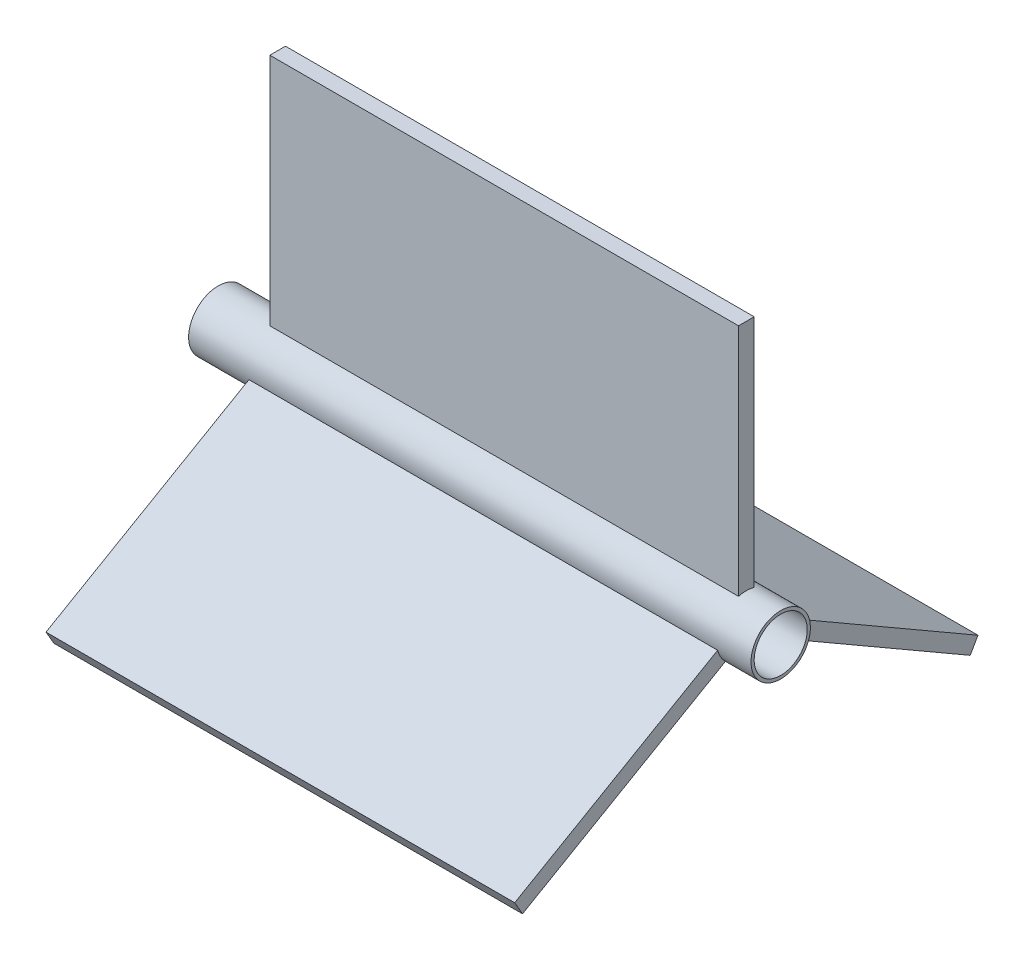
ISO-10303-21;
HEADER;
FILE_DESCRIPTION(('STEP AP214'),'2;1');
FILE_NAME('part.step','',(''),(''),'','','');
FILE_SCHEMA(('AUTOMOTIVE_DESIGN { 1 0 10303 214 1 1 1 1 }'));
ENDSEC;
DATA;
#1=APPLICATION_CONTEXT('core data for automotive mechanical design processes');
#2=APPLICATION_PROTOCOL_DEFINITION('international standard','automotive_design',2000,#1);
#3=PRODUCT_CONTEXT('',#1,'mechanical');
#4=PRODUCT('Part','Part','',(#3));
#5=PRODUCT_RELATED_PRODUCT_CATEGORY('part','',(#4));
#6=PRODUCT_DEFINITION_FORMATION('','',#4);
#7=PRODUCT_DEFINITION_CONTEXT('part definition',#1,'design');
#8=PRODUCT_DEFINITION('design','',#6,#7);
#9=PRODUCT_DEFINITION_SHAPE('','',#8);
#10=(LENGTH_UNIT() NAMED_UNIT(*) SI_UNIT(.MILLI.,.METRE.));
#11=(NAMED_UNIT(*) PLANE_ANGLE_UNIT() SI_UNIT($,.RADIAN.));
#12=(NAMED_UNIT(*) SI_UNIT($,.STERADIAN.) SOLID_ANGLE_UNIT());
#13=UNCERTAINTY_MEASURE_WITH_UNIT(LENGTH_MEASURE(1.E-05),#10,'distance_accuracy_value','');
#14=(GEOMETRIC_REPRESENTATION_CONTEXT(3) GLOBAL_UNCERTAINTY_ASSIGNED_CONTEXT((#13)) GLOBAL_UNIT_ASSIGNED_CONTEXT((#10,
#11,#12)) REPRESENTATION_CONTEXT('',''));
#15=CARTESIAN_POINT('',(0.,0.,0.));
#16=DIRECTION('',(0.,0.,1.));
#17=DIRECTION('',(1.,0.,0.));
#18=AXIS2_PLACEMENT_3D('',#15,#16,#17);
#19=CARTESIAN_POINT('',(180.,0.,0.));
#20=DIRECTION('',(-1.,0.,0.));
#21=DIRECTION('',(0.,0.,1.));
#22=AXIS2_PLACEMENT_3D('',#19,#20,#21);
#23=CYLINDRICAL_SURFACE('',#22,9.5);
#24=CARTESIAN_POINT('',(19.,0.,0.));
#25=DIRECTION('',(1.,0.,0.));
#26=DIRECTION('',(0.,0.,-1.));
#27=AXIS2_PLACEMENT_3D('',#24,#25,#26);
#28=CIRCLE('',#27,9.5);
#29=CARTESIAN_POINT('',(19.,-2.4175121854455,9.18725393302111));
#30=VERTEX_POINT('',#29);
#31=CARTESIAN_POINT('',(19.,-6.74763920444121,6.68725393315839));
#32=VERTEX_POINT('',#31);
#33=EDGE_CURVE('E231',#30,#32,#28,.T.);
#34=ORIENTED_EDGE('',*,*,#33,.F.);
#35=DIRECTION('',(1.,0.,0.));
#36=VECTOR('',#35,1.);
#37=CARTESIAN_POINT('',(19.,-2.4175121854455,9.18725393302111));
#38=LINE('',#37,#36);
#39=CARTESIAN_POINT('',(169.,-2.4175121854455,9.18725393302111));
#40=VERTEX_POINT('',#39);
#41=EDGE_CURVE('E170',#30,#40,#38,.T.);
#42=ORIENTED_EDGE('',*,*,#41,.T.);
#43=CARTESIAN_POINT('',(169.,0.,0.));
#44=DIRECTION('',(1.,0.,0.));
#45=DIRECTION('',(0.,0.,-1.));
#46=AXIS2_PLACEMENT_3D('',#43,#44,#45);
#47=CIRCLE('',#46,9.5);
#48=CARTESIAN_POINT('',(169.,-6.74763920443601,6.68725393317453));
#49=VERTEX_POINT('',#48);
#50=EDGE_CURVE('E228',#40,#49,#47,.T.);
#51=ORIENTED_EDGE('',*,*,#50,.T.);
#52=DIRECTION('',(1.,0.,0.));
#53=VECTOR('',#52,1.);
#54=CARTESIAN_POINT('',(19.,-6.74763920444121,6.68725393315839));
#55=LINE('',#54,#53);
#56=EDGE_CURVE('E167',#32,#49,#55,.T.);
#57=ORIENTED_EDGE('',*,*,#56,.F.);
#58=EDGE_LOOP('',(#34,#42,#51,#57));
#59=FACE_BOUND('',#58,.T.);
#60=CARTESIAN_POINT('',(0.,0.,0.));
#61=DIRECTION('',(1.,0.,0.));
#62=DIRECTION('',(0.,0.,-1.));
#63=AXIS2_PLACEMENT_3D('',#60,#61,#62);
#64=CIRCLE('',#63,9.5);
#65=CARTESIAN_POINT('',(0.,0.,-9.5));
#66=VERTEX_POINT('',#65);
#67=EDGE_CURVE('E210',#66,#66,#64,.T.);
#68=ORIENTED_EDGE('',*,*,#67,.T.);
#69=EDGE_LOOP('',(#68));
#70=FACE_BOUND('',#69,.T.);
#71=CARTESIAN_POINT('',(180.,0.,0.));
#72=DIRECTION('',(1.,0.,0.));
#73=DIRECTION('',(0.,0.,-1.));
#74=AXIS2_PLACEMENT_3D('',#71,#72,#73);
#75=CIRCLE('',#74,9.5);
#76=CARTESIAN_POINT('',(180.,0.,-9.5));
#77=VERTEX_POINT('',#76);
#78=EDGE_CURVE('E218',#77,#77,#75,.T.);
#79=ORIENTED_EDGE('',*,*,#78,.F.);
#80=EDGE_LOOP('',(#79));
#81=FACE_BOUND('',#80,.T.);
#82=CARTESIAN_POINT('',(19.,0.,0.));
#83=DIRECTION('',(1.,0.,0.));
#84=DIRECTION('',(0.,0.,-1.));
#85=AXIS2_PLACEMENT_3D('',#82,#83,#84);
#86=CIRCLE('',#85,9.5);
#87=CARTESIAN_POINT('',(19.,9.16515138993645,-2.49999999999773));
#88=VERTEX_POINT('',#87);
#89=CARTESIAN_POINT('',(19.,9.16515138993645,2.49999999999773));
#90=VERTEX_POINT('',#89);
#91=EDGE_CURVE('E226',#88,#90,#86,.T.);
#92=ORIENTED_EDGE('',*,*,#91,.F.);
#93=DIRECTION('',(1.,0.,0.));
#94=VECTOR('',#93,1.);
#95=CARTESIAN_POINT('',(19.,9.16515138993645,-2.49999999999773));
#96=LINE('',#95,#94);
#97=CARTESIAN_POINT('',(169.,9.16515138993645,-2.49999999999773));
#98=VERTEX_POINT('',#97);
#99=EDGE_CURVE('E213',#88,#98,#96,.T.);
#100=ORIENTED_EDGE('',*,*,#99,.T.);
#101=CARTESIAN_POINT('',(169.,0.,0.));
#102=DIRECTION('',(1.,0.,0.));
#103=DIRECTION('',(0.,0.,-1.));
#104=AXIS2_PLACEMENT_3D('',#101,#102,#103);
#105=CIRCLE('',#104,9.5);
#106=CARTESIAN_POINT('',(169.,9.16515138993645,2.49999999990917));
#107=VERTEX_POINT('',#106);
#108=EDGE_CURVE('E221',#98,#107,#105,.T.);
#109=ORIENTED_EDGE('',*,*,#108,.T.);
#110=DIRECTION('',(1.,0.,0.));
#111=VECTOR('',#110,1.);
#112=CARTESIAN_POINT('',(19.,9.16515138993645,2.49999999999773));
#113=LINE('',#112,#111);
#114=EDGE_CURVE('E201',#90,#107,#113,.T.);
#115=ORIENTED_EDGE('',*,*,#114,.F.);
#116=EDGE_LOOP('',(#92,#100,#109,#115));
#117=FACE_BOUND('',#116,.T.);
#118=CARTESIAN_POINT('',(19.,0.,0.));
#119=DIRECTION('',(1.,0.,0.));
#120=DIRECTION('',(0.,0.,-1.));
#121=AXIS2_PLACEMENT_3D('',#118,#119,#120);
#122=CIRCLE('',#121,9.5);
#123=CARTESIAN_POINT('',(19.,-6.74763920443411,-6.68725393322234));
#124=VERTEX_POINT('',#123);
#125=CARTESIAN_POINT('',(19.,-2.41751218533182,-9.18725393327691));
#126=VERTEX_POINT('',#125);
#127=EDGE_CURVE('E11',#124,#126,#122,.T.);
#128=ORIENTED_EDGE('',*,*,#127,.F.);
#129=DIRECTION('',(1.,0.,0.));
#130=VECTOR('',#129,1.);
#131=CARTESIAN_POINT('',(19.,-6.74763920443411,-6.68725393322234));
#132=LINE('',#131,#130);
#133=CARTESIAN_POINT('',(169.,-6.74763920443411,-6.68725393322234));
#134=VERTEX_POINT('',#133);
#135=EDGE_CURVE('E235',#124,#134,#132,.T.);
#136=ORIENTED_EDGE('',*,*,#135,.T.);
#137=CARTESIAN_POINT('',(169.,0.,0.));
#138=DIRECTION('',(1.,0.,0.));
#139=DIRECTION('',(0.,0.,-1.));
#140=AXIS2_PLACEMENT_3D('',#137,#138,#139);
#141=CIRCLE('',#140,9.5);
#142=CARTESIAN_POINT('',(169.,-2.41751218548278,-9.18725393319692));
#143=VERTEX_POINT('',#142);
#144=EDGE_CURVE('E54',#134,#143,#141,.T.);
#145=ORIENTED_EDGE('',*,*,#144,.T.);
#146=DIRECTION('',(1.,0.,0.));
#147=VECTOR('',#146,1.);
#148=CARTESIAN_POINT('',(19.,-2.41751218533182,-9.18725393327691));
#149=LINE('',#148,#147);
#150=EDGE_CURVE('E149',#126,#143,#149,.T.);
#151=ORIENTED_EDGE('',*,*,#150,.F.);
#152=EDGE_LOOP('',(#128,#136,#145,#151));
#153=FACE_BOUND('',#152,.T.);
#154=ADVANCED_FACE('F47',(#59,#70,#81,#117,#153),#23,.T.);
#155=CARTESIAN_POINT('',(180.,0.,0.));
#156=DIRECTION('',(1.,0.,0.));
#157=DIRECTION('',(0.,0.,-1.));
#158=AXIS2_PLACEMENT_3D('',#155,#156,#157);
#159=PLANE('',#158);
#160=CARTESIAN_POINT('',(180.,0.,0.));
#161=DIRECTION('',(-1.,0.,0.));
#162=DIRECTION('',(0.,0.,1.));
#163=AXIS2_PLACEMENT_3D('',#160,#161,#162);
#164=CIRCLE('',#163,8.5);
#165=CARTESIAN_POINT('',(180.,0.,8.5));
#166=VERTEX_POINT('',#165);
#167=EDGE_CURVE('E145',#166,#166,#164,.T.);
#168=ORIENTED_EDGE('',*,*,#167,.T.);
#169=EDGE_LOOP('',(#168));
#170=FACE_BOUND('',#169,.T.);
#171=ORIENTED_EDGE('',*,*,#78,.T.);
#172=EDGE_LOOP('',(#171));
#173=FACE_BOUND('',#172,.T.);
#174=ADVANCED_FACE('F248',(#170,#173),#159,.T.);
#175=CARTESIAN_POINT('',(0.,0.,0.));
#176=DIRECTION('',(1.,0.,0.));
#177=DIRECTION('',(0.,0.,-1.));
#178=AXIS2_PLACEMENT_3D('',#175,#176,#177);
#179=PLANE('',#178);
#180=CARTESIAN_POINT('',(0.,0.,0.));
#181=DIRECTION('',(-1.,0.,0.));
#182=DIRECTION('',(0.,0.,1.));
#183=AXIS2_PLACEMENT_3D('',#180,#181,#182);
#184=CIRCLE('',#183,8.5);
#185=CARTESIAN_POINT('',(0.,0.,8.5));
#186=VERTEX_POINT('',#185);
#187=EDGE_CURVE('E242',#186,#186,#184,.T.);
#188=ORIENTED_EDGE('',*,*,#187,.F.);
#189=EDGE_LOOP('',(#188));
#190=FACE_BOUND('',#189,.T.);
#191=ORIENTED_EDGE('',*,*,#67,.F.);
#192=EDGE_LOOP('',(#191));
#193=FACE_BOUND('',#192,.T.);
#194=ADVANCED_FACE('F257',(#190,#193),#179,.F.);
#195=CARTESIAN_POINT('',(19.,-291589.55,2.49999999999773));
#196=DIRECTION('',(0.,0.,1.));
#197=DIRECTION('',(1.,0.,0.));
#198=AXIS2_PLACEMENT_3D('',#195,#196,#197);
#199=PLANE('',#198);
#200=DIRECTION('',(0.,-1.,0.));
#201=VECTOR('',#200,1.);
#202=CARTESIAN_POINT('',(169.,-291589.55,2.49999999999773));
#203=LINE('',#202,#201);
#204=CARTESIAN_POINT('',(169.,84.1651513899251,2.49999999999773));
#205=VERTEX_POINT('',#204);
#206=EDGE_CURVE('E183',#205,#107,#203,.T.);
#207=ORIENTED_EDGE('',*,*,#206,.F.);
#208=DIRECTION('',(1.,0.,0.));
#209=VECTOR('',#208,1.);
#210=CARTESIAN_POINT('',(19.,84.1651513899251,2.49999999999773));
#211=LINE('',#210,#209);
#212=CARTESIAN_POINT('',(19.,84.1651513899251,2.49999999999773));
#213=VERTEX_POINT('',#212);
#214=EDGE_CURVE('E208',#213,#205,#211,.T.);
#215=ORIENTED_EDGE('',*,*,#214,.F.);
#216=DIRECTION('',(0.,-1.,0.));
#217=VECTOR('',#216,1.);
#218=CARTESIAN_POINT('',(19.,-291589.55,2.49999999999773));
#219=LINE('',#218,#217);
#220=EDGE_CURVE('E191',#213,#90,#219,.T.);
#221=ORIENTED_EDGE('',*,*,#220,.T.);
#222=ORIENTED_EDGE('',*,*,#114,.T.);
#223=EDGE_LOOP('',(#207,#215,#221,#222));
#224=FACE_BOUND('',#223,.T.);
#225=ADVANCED_FACE('F260',(#224),#199,.T.);
#226=CARTESIAN_POINT('',(19.,84.1651513899251,400000.));
#227=DIRECTION('',(0.,1.,0.));
#228=DIRECTION('',(0.,0.,1.));
#229=AXIS2_PLACEMENT_3D('',#226,#227,#228);
#230=PLANE('',#229);
#231=DIRECTION('',(0.,0.,1.));
#232=VECTOR('',#231,1.);
#233=CARTESIAN_POINT('',(169.,84.1651513899251,400000.));
#234=LINE('',#233,#232);
#235=CARTESIAN_POINT('',(169.,84.1651513899251,-2.49999999999773));
#236=VERTEX_POINT('',#235);
#237=EDGE_CURVE('E195',#236,#205,#234,.T.);
#238=ORIENTED_EDGE('',*,*,#237,.F.);
#239=DIRECTION('',(1.,0.,0.));
#240=VECTOR('',#239,1.);
#241=CARTESIAN_POINT('',(19.,84.1651513899251,-2.49999999999773));
#242=LINE('',#241,#240);
#243=CARTESIAN_POINT('',(19.,84.1651513899251,-2.49999999999773));
#244=VERTEX_POINT('',#243);
#245=EDGE_CURVE('E211',#244,#236,#242,.T.);
#246=ORIENTED_EDGE('',*,*,#245,.F.);
#247=DIRECTION('',(0.,0.,1.));
#248=VECTOR('',#247,1.);
#249=CARTESIAN_POINT('',(19.,84.1651513899251,400000.));
#250=LINE('',#249,#248);
#251=EDGE_CURVE('E198',#244,#213,#250,.T.);
#252=ORIENTED_EDGE('',*,*,#251,.T.);
#253=ORIENTED_EDGE('',*,*,#214,.T.);
#254=EDGE_LOOP('',(#238,#246,#252,#253));
#255=FACE_BOUND('',#254,.T.);
#256=ADVANCED_FACE('F279',(#255),#230,.T.);
#257=CARTESIAN_POINT('',(19.,-291589.55,-2.49999999999773));
#258=DIRECTION('',(0.,0.,-1.));
#259=DIRECTION('',(-1.,0.,0.));
#260=AXIS2_PLACEMENT_3D('',#257,#258,#259);
#261=PLANE('',#260);
#262=DIRECTION('',(0.,1.,0.));
#263=VECTOR('',#262,1.);
#264=CARTESIAN_POINT('',(169.,-291589.55,-2.49999999999773));
#265=LINE('',#264,#263);
#266=EDGE_CURVE('E203',#98,#236,#265,.T.);
#267=ORIENTED_EDGE('',*,*,#266,.F.);
#268=ORIENTED_EDGE('',*,*,#99,.F.);
#269=DIRECTION('',(0.,1.,0.));
#270=VECTOR('',#269,1.);
#271=CARTESIAN_POINT('',(19.,-291589.55,-2.49999999999773));
#272=LINE('',#271,#270);
#273=EDGE_CURVE('E194',#88,#244,#272,.T.);
#274=ORIENTED_EDGE('',*,*,#273,.T.);
#275=ORIENTED_EDGE('',*,*,#245,.T.);
#276=EDGE_LOOP('',(#267,#268,#274,#275));
#277=FACE_BOUND('',#276,.T.);
#278=ADVANCED_FACE('F282',(#277),#261,.T.);
#279=CARTESIAN_POINT('',(19.,0.,0.));
#280=DIRECTION('',(1.,0.,0.));
#281=DIRECTION('',(0.,0.,-1.));
#282=AXIS2_PLACEMENT_3D('',#279,#280,#281);
#283=PLANE('',#282);
#284=ORIENTED_EDGE('',*,*,#273,.F.);
#285=ORIENTED_EDGE('',*,*,#91,.T.);
#286=ORIENTED_EDGE('',*,*,#220,.F.);
#287=ORIENTED_EDGE('',*,*,#251,.F.);
#288=EDGE_LOOP('',(#284,#285,#286,#287));
#289=FACE_BOUND('',#288,.T.);
#290=ADVANCED_FACE('F273',(#289),#283,.F.);
#291=CARTESIAN_POINT('',(169.,0.,0.));
#292=DIRECTION('',(1.,0.,0.));
#293=DIRECTION('',(0.,0.,-1.));
#294=AXIS2_PLACEMENT_3D('',#291,#292,#293);
#295=PLANE('',#294);
#296=ORIENTED_EDGE('',*,*,#108,.F.);
#297=ORIENTED_EDGE('',*,*,#266,.T.);
#298=ORIENTED_EDGE('',*,*,#237,.T.);
#299=ORIENTED_EDGE('',*,*,#206,.T.);
#300=EDGE_LOOP('',(#296,#297,#298,#299));
#301=FACE_BOUND('',#300,.T.);
#302=ADVANCED_FACE('F284',(#301),#295,.T.);
#303=CARTESIAN_POINT('',(19.,-246104.633320397,426260.728889037));
#304=DIRECTION('',(0.,-0.866025403784439,-0.499999999999999));
#305=DIRECTION('',(0.,0.499999999999999,-0.866025403784439));
#306=AXIS2_PLACEMENT_3D('',#303,#304,#305);
#307=PLANE('',#306);
#308=DIRECTION('',(0.,0.499999999999999,-0.866025403784439));
#309=VECTOR('',#308,1.);
#310=CARTESIAN_POINT('',(169.,-246104.633320397,426260.728889037));
#311=LINE('',#310,#309);
#312=CARTESIAN_POINT('',(169.,-44.2476392044355,71.6391592169963));
#313=VERTEX_POINT('',#312);
#314=EDGE_CURVE('E69',#313,#49,#311,.T.);
#315=ORIENTED_EDGE('',*,*,#314,.F.);
#316=DIRECTION('',(1.,0.,0.));
#317=VECTOR('',#316,1.);
#318=CARTESIAN_POINT('',(19.,-44.2476392044355,71.6391592169963));
#319=LINE('',#318,#317);
#320=CARTESIAN_POINT('',(19.,-44.2476392044355,71.6391592169963));
#321=VERTEX_POINT('',#320);
#322=EDGE_CURVE('E151',#321,#313,#319,.T.);
#323=ORIENTED_EDGE('',*,*,#322,.F.);
#324=DIRECTION('',(0.,0.499999999999999,-0.866025403784439));
#325=VECTOR('',#324,1.);
#326=CARTESIAN_POINT('',(19.,-246104.633320397,426260.728889037));
#327=LINE('',#326,#325);
#328=EDGE_CURVE('E179',#321,#32,#327,.T.);
#329=ORIENTED_EDGE('',*,*,#328,.T.);
#330=ORIENTED_EDGE('',*,*,#56,.T.);
#331=EDGE_LOOP('',(#315,#323,#329,#330));
#332=FACE_BOUND('',#331,.T.);
#333=ADVANCED_FACE('F286',(#332),#307,.T.);
#334=CARTESIAN_POINT('',(19.,-45529.1643188124,-26189.0897298217));
#335=DIRECTION('',(0.,-0.49999999999999,0.866025403784444));
#336=DIRECTION('',(0.,-0.866025403784444,-0.49999999999999));
#337=AXIS2_PLACEMENT_3D('',#334,#335,#336);
#338=PLANE('',#337);
#339=DIRECTION('',(0.,-0.866025403784444,-0.49999999999999));
#340=VECTOR('',#339,1.);
#341=CARTESIAN_POINT('',(169.,-45529.1643188124,-26189.0897298217));
#342=LINE('',#341,#340);
#343=CARTESIAN_POINT('',(169.,-39.9175121855109,74.1391592169975));
#344=VERTEX_POINT('',#343);
#345=EDGE_CURVE('E176',#344,#313,#342,.T.);
#346=ORIENTED_EDGE('',*,*,#345,.F.);
#347=DIRECTION('',(1.,0.,0.));
#348=VECTOR('',#347,1.);
#349=CARTESIAN_POINT('',(19.,-39.9175121855109,74.1391592169975));
#350=LINE('',#349,#348);
#351=CARTESIAN_POINT('',(19.,-39.9175121855109,74.1391592169975));
#352=VERTEX_POINT('',#351);
#353=EDGE_CURVE('E173',#352,#344,#350,.T.);
#354=ORIENTED_EDGE('',*,*,#353,.F.);
#355=DIRECTION('',(0.,-0.866025403784444,-0.49999999999999));
#356=VECTOR('',#355,1.);
#357=CARTESIAN_POINT('',(19.,-45529.1643188124,-26189.0897298217));
#358=LINE('',#357,#356);
#359=EDGE_CURVE('E169',#352,#321,#358,.T.);
#360=ORIENTED_EDGE('',*,*,#359,.T.);
#361=ORIENTED_EDGE('',*,*,#322,.T.);
#362=EDGE_LOOP('',(#346,#354,#360,#361));
#363=FACE_BOUND('',#362,.T.);
#364=ADVANCED_FACE('F292',(#363),#338,.T.);
#365=CARTESIAN_POINT('',(19.,-246100.303193378,426263.228889037));
#366=DIRECTION('',(0.,0.866025403784439,0.499999999999999));
#367=DIRECTION('',(0.,-0.499999999999999,0.866025403784439));
#368=AXIS2_PLACEMENT_3D('',#365,#366,#367);
#369=PLANE('',#368);
#370=DIRECTION('',(0.,-0.499999999999999,0.866025403784439));
#371=VECTOR('',#370,1.);
#372=CARTESIAN_POINT('',(169.,-246100.303193378,426263.228889037));
#373=LINE('',#372,#371);
#374=EDGE_CURVE('E178',#40,#344,#373,.T.);
#375=ORIENTED_EDGE('',*,*,#374,.F.);
#376=ORIENTED_EDGE('',*,*,#41,.F.);
#377=DIRECTION('',(0.,-0.499999999999999,0.866025403784439));
#378=VECTOR('',#377,1.);
#379=CARTESIAN_POINT('',(19.,-246100.303193378,426263.228889037));
#380=LINE('',#379,#378);
#381=EDGE_CURVE('E186',#30,#352,#380,.T.);
#382=ORIENTED_EDGE('',*,*,#381,.T.);
#383=ORIENTED_EDGE('',*,*,#353,.T.);
#384=EDGE_LOOP('',(#375,#376,#382,#383));
#385=FACE_BOUND('',#384,.T.);
#386=ADVANCED_FACE('F384',(#385),#369,.T.);
#387=CARTESIAN_POINT('',(19.,0.,0.));
#388=DIRECTION('',(1.,0.,0.));
#389=DIRECTION('',(0.,0.,-1.));
#390=AXIS2_PLACEMENT_3D('',#387,#388,#389);
#391=PLANE('',#390);
#392=ORIENTED_EDGE('',*,*,#381,.F.);
#393=ORIENTED_EDGE('',*,*,#33,.T.);
#394=ORIENTED_EDGE('',*,*,#328,.F.);
#395=ORIENTED_EDGE('',*,*,#359,.F.);
#396=EDGE_LOOP('',(#392,#393,#394,#395));
#397=FACE_BOUND('',#396,.T.);
#398=ADVANCED_FACE('F375',(#397),#391,.F.);
#399=CARTESIAN_POINT('',(169.,0.,0.));
#400=DIRECTION('',(1.,0.,0.));
#401=DIRECTION('',(0.,0.,-1.));
#402=AXIS2_PLACEMENT_3D('',#399,#400,#401);
#403=PLANE('',#402);
#404=ORIENTED_EDGE('',*,*,#50,.F.);
#405=ORIENTED_EDGE('',*,*,#374,.T.);
#406=ORIENTED_EDGE('',*,*,#345,.T.);
#407=ORIENTED_EDGE('',*,*,#314,.T.);
#408=EDGE_LOOP('',(#404,#405,#406,#407));
#409=FACE_BOUND('',#408,.T.);
#410=ADVANCED_FACE('F366',(#409),#403,.T.);
#411=CARTESIAN_POINT('',(19.,100309.858320397,173736.771110964));
#412=DIRECTION('',(0.,0.866025403784439,-0.5));
#413=DIRECTION('',(0.,0.5,0.866025403784439));
#414=AXIS2_PLACEMENT_3D('',#411,#412,#413);
#415=PLANE('',#414);
#416=DIRECTION('',(0.,0.5,0.866025403784439));
#417=VECTOR('',#416,1.);
#418=CARTESIAN_POINT('',(169.,100309.858320397,173736.771110964));
#419=LINE('',#418,#417);
#420=CARTESIAN_POINT('',(169.,-39.9175121853546,-74.1391592170544));
#421=VERTEX_POINT('',#420);
#422=EDGE_CURVE('E61',#421,#143,#419,.T.);
#423=ORIENTED_EDGE('',*,*,#422,.F.);
#424=DIRECTION('',(1.,0.,0.));
#425=VECTOR('',#424,1.);
#426=CARTESIAN_POINT('',(19.,-39.9175121853546,-74.1391592170544));
#427=LINE('',#426,#425);
#428=CARTESIAN_POINT('',(19.,-39.9175121853546,-74.1391592170544));
#429=VERTEX_POINT('',#428);
#430=EDGE_CURVE('E136',#429,#421,#427,.T.);
#431=ORIENTED_EDGE('',*,*,#430,.F.);
#432=DIRECTION('',(0.,0.5,0.866025403784439));
#433=VECTOR('',#432,1.);
#434=CARTESIAN_POINT('',(19.,100309.858320397,173736.771110964));
#435=LINE('',#434,#433);
#436=EDGE_CURVE('E157',#429,#126,#435,.T.);
#437=ORIENTED_EDGE('',*,*,#436,.T.);
#438=ORIENTED_EDGE('',*,*,#150,.T.);
#439=EDGE_LOOP('',(#423,#431,#437,#438));
#440=FACE_BOUND('',#439,.T.);
#441=ADVANCED_FACE('F147',(#440),#415,.T.);
#442=CARTESIAN_POINT('',(19.,-391939.325832583,226189.089729814));
#443=DIRECTION('',(0.,-0.49999999999999,-0.866025403784444));
#444=DIRECTION('',(0.,0.866025403784444,-0.49999999999999));
#445=AXIS2_PLACEMENT_3D('',#442,#443,#444);
#446=PLANE('',#445);
#447=DIRECTION('',(0.,0.866025403784444,-0.49999999999999));
#448=VECTOR('',#447,1.);
#449=CARTESIAN_POINT('',(169.,-391939.325832583,226189.089729814));
#450=LINE('',#449,#448);
#451=CARTESIAN_POINT('',(169.,-44.2476392042863,-71.6391592170567));
#452=VERTEX_POINT('',#451);
#453=EDGE_CURVE('E138',#452,#421,#450,.T.);
#454=ORIENTED_EDGE('',*,*,#453,.F.);
#455=DIRECTION('',(1.,0.,0.));
#456=VECTOR('',#455,1.);
#457=CARTESIAN_POINT('',(19.,-44.2476392042863,-71.6391592170567));
#458=LINE('',#457,#456);
#459=CARTESIAN_POINT('',(19.,-44.2476392042863,-71.6391592170567));
#460=VERTEX_POINT('',#459);
#461=EDGE_CURVE('E144',#460,#452,#458,.T.);
#462=ORIENTED_EDGE('',*,*,#461,.F.);
#463=DIRECTION('',(0.,0.866025403784444,-0.49999999999999));
#464=VECTOR('',#463,1.);
#465=CARTESIAN_POINT('',(19.,-391939.325832583,226189.089729814));
#466=LINE('',#465,#464);
#467=EDGE_CURVE('E140',#460,#429,#466,.T.);
#468=ORIENTED_EDGE('',*,*,#467,.T.);
#469=ORIENTED_EDGE('',*,*,#430,.T.);
#470=EDGE_LOOP('',(#454,#462,#468,#469));
#471=FACE_BOUND('',#470,.T.);
#472=ADVANCED_FACE('F137',(#471),#446,.T.);
#473=CARTESIAN_POINT('',(19.,100305.528193378,173739.271110964));
#474=DIRECTION('',(0.,-0.866025403784439,0.5));
#475=DIRECTION('',(0.,-0.5,-0.866025403784439));
#476=AXIS2_PLACEMENT_3D('',#473,#474,#475);
#477=PLANE('',#476);
#478=DIRECTION('',(0.,-0.5,-0.866025403784439));
#479=VECTOR('',#478,1.);
#480=CARTESIAN_POINT('',(169.,100305.528193378,173739.271110964));
#481=LINE('',#480,#479);
#482=EDGE_CURVE('E152',#134,#452,#481,.T.);
#483=ORIENTED_EDGE('',*,*,#482,.F.);
#484=ORIENTED_EDGE('',*,*,#135,.F.);
#485=DIRECTION('',(0.,-0.5,-0.866025403784439));
#486=VECTOR('',#485,1.);
#487=CARTESIAN_POINT('',(19.,100305.528193378,173739.271110964));
#488=LINE('',#487,#486);
#489=EDGE_CURVE('E160',#124,#460,#488,.T.);
#490=ORIENTED_EDGE('',*,*,#489,.T.);
#491=ORIENTED_EDGE('',*,*,#461,.T.);
#492=EDGE_LOOP('',(#483,#484,#490,#491));
#493=FACE_BOUND('',#492,.T.);
#494=ADVANCED_FACE('F237',(#493),#477,.T.);
#495=CARTESIAN_POINT('',(19.,0.,0.));
#496=DIRECTION('',(1.,0.,0.));
#497=DIRECTION('',(0.,0.,-1.));
#498=AXIS2_PLACEMENT_3D('',#495,#496,#497);
#499=PLANE('',#498);
#500=ORIENTED_EDGE('',*,*,#489,.F.);
#501=ORIENTED_EDGE('',*,*,#127,.T.);
#502=ORIENTED_EDGE('',*,*,#436,.F.);
#503=ORIENTED_EDGE('',*,*,#467,.F.);
#504=EDGE_LOOP('',(#500,#501,#502,#503));
#505=FACE_BOUND('',#504,.T.);
#506=ADVANCED_FACE('F334',(#505),#499,.F.);
#507=CARTESIAN_POINT('',(169.,0.,0.));
#508=DIRECTION('',(1.,0.,0.));
#509=DIRECTION('',(0.,0.,-1.));
#510=AXIS2_PLACEMENT_3D('',#507,#508,#509);
#511=PLANE('',#510);
#512=ORIENTED_EDGE('',*,*,#144,.F.);
#513=ORIENTED_EDGE('',*,*,#482,.T.);
#514=ORIENTED_EDGE('',*,*,#453,.T.);
#515=ORIENTED_EDGE('',*,*,#422,.T.);
#516=EDGE_LOOP('',(#512,#513,#514,#515));
#517=FACE_BOUND('',#516,.T.);
#518=ADVANCED_FACE('F155',(#517),#511,.T.);
#519=CARTESIAN_POINT('',(180.,0.,0.));
#520=DIRECTION('',(-1.,0.,0.));
#521=DIRECTION('',(0.,0.,1.));
#522=AXIS2_PLACEMENT_3D('',#519,#520,#521);
#523=CYLINDRICAL_SURFACE('',#522,8.5);
#524=CARTESIAN_POINT('',(180.,0.,8.5));
#525=CARTESIAN_POINT('',(178.125,0.,8.5));
#526=CARTESIAN_POINT('',(176.25,0.,8.5));
#527=CARTESIAN_POINT('',(172.5,0.,8.5));
#528=CARTESIAN_POINT('',(170.625,0.,8.5));
#529=CARTESIAN_POINT('',(166.875,0.,8.5));
#530=CARTESIAN_POINT('',(165.,0.,8.5));
#531=CARTESIAN_POINT('',(161.25,0.,8.5));
#532=CARTESIAN_POINT('',(159.375,0.,8.5));
#533=CARTESIAN_POINT('',(155.625,0.,8.5));
#534=CARTESIAN_POINT('',(153.75,0.,8.5));
#535=CARTESIAN_POINT('',(150.,0.,8.5));
#536=CARTESIAN_POINT('',(148.125,0.,8.5));
#537=CARTESIAN_POINT('',(144.375,0.,8.5));
#538=CARTESIAN_POINT('',(142.5,0.,8.5));
#539=CARTESIAN_POINT('',(138.75,0.,8.5));
#540=CARTESIAN_POINT('',(136.875,0.,8.5));
#541=CARTESIAN_POINT('',(133.125,0.,8.5));
#542=CARTESIAN_POINT('',(131.25,0.,8.5));
#543=CARTESIAN_POINT('',(127.5,0.,8.5));
#544=CARTESIAN_POINT('',(125.625,0.,8.5));
#545=CARTESIAN_POINT('',(121.875,0.,8.5));
#546=CARTESIAN_POINT('',(120.,0.,8.5));
#547=CARTESIAN_POINT('',(116.25,0.,8.5));
#548=CARTESIAN_POINT('',(114.375,0.,8.5));
#549=CARTESIAN_POINT('',(110.625,0.,8.5));
#550=CARTESIAN_POINT('',(108.75,0.,8.5));
#551=CARTESIAN_POINT('',(105.,0.,8.5));
#552=CARTESIAN_POINT('',(103.125,0.,8.5));
#553=CARTESIAN_POINT('',(99.375,0.,8.5));
#554=CARTESIAN_POINT('',(97.5,0.,8.5));
#555=CARTESIAN_POINT('',(93.75,0.,8.5));
#556=CARTESIAN_POINT('',(91.875,0.,8.5));
#557=CARTESIAN_POINT('',(88.125,0.,8.5));
#558=CARTESIAN_POINT('',(86.25,0.,8.5));
#559=CARTESIAN_POINT('',(82.5,0.,8.5));
#560=CARTESIAN_POINT('',(80.625,0.,8.5));
#561=CARTESIAN_POINT('',(76.875,0.,8.5));
#562=CARTESIAN_POINT('',(75.,0.,8.5));
#563=CARTESIAN_POINT('',(71.25,0.,8.5));
#564=CARTESIAN_POINT('',(69.375,0.,8.5));
#565=CARTESIAN_POINT('',(65.625,0.,8.5));
#566=CARTESIAN_POINT('',(63.75,0.,8.5));
#567=CARTESIAN_POINT('',(60.,0.,8.5));
#568=CARTESIAN_POINT('',(58.125,0.,8.5));
#569=CARTESIAN_POINT('',(54.375,0.,8.5));
#570=CARTESIAN_POINT('',(52.5,0.,8.5));
#571=CARTESIAN_POINT('',(48.75,0.,8.5));
#572=CARTESIAN_POINT('',(46.875,0.,8.5));
#573=CARTESIAN_POINT('',(43.125,0.,8.5));
#574=CARTESIAN_POINT('',(41.25,0.,8.5));
#575=CARTESIAN_POINT('',(37.5,0.,8.5));
#576=CARTESIAN_POINT('',(35.625,0.,8.5));
#577=CARTESIAN_POINT('',(31.875,0.,8.5));
#578=CARTESIAN_POINT('',(30.,0.,8.5));
#579=CARTESIAN_POINT('',(26.25,0.,8.5));
#580=CARTESIAN_POINT('',(24.375,0.,8.5));
#581=CARTESIAN_POINT('',(20.625,0.,8.5));
#582=CARTESIAN_POINT('',(18.75,0.,8.5));
#583=CARTESIAN_POINT('',(15.,0.,8.5));
#584=CARTESIAN_POINT('',(13.125,0.,8.5));
#585=CARTESIAN_POINT('',(9.37500000000003,0.,8.5));
#586=CARTESIAN_POINT('',(7.50000000000002,0.,8.5));
#587=CARTESIAN_POINT('',(3.75000000000002,0.,8.5));
#588=CARTESIAN_POINT('',(1.87500000000003,0.,8.5));
#589=CARTESIAN_POINT('',(0.,0.,8.5));
#590=B_SPLINE_CURVE_WITH_KNOTS('',3,(#524,#525,#526,#527,#528,#529,#530,#531,#532,#533,#534,
#535,#536,#537,#538,#539,#540,#541,#542,#543,#544,#545,#546,#547,#548,#549,#550,#551,#552,#553,
#554,#555,#556,#557,#558,#559,#560,#561,#562,#563,#564,#565,#566,#567,#568,#569,#570,#571,#572,
#573,#574,#575,#576,#577,#578,#579,#580,#581,#582,#583,#584,#585,#586,#587,#588,#589),
.UNSPECIFIED.,.F.,.F.,(4,2,2,2,2,2,2,2,2,2,2,2,2,2,2,2,2,2,2,2,2,2,2,2,2,2,2,2,2,2,2,2,4),(0.,
5.62500000000002,11.25,16.875,22.5,28.125,33.75,39.375,45.,50.625,56.25,61.875,67.5,73.125,
78.75,84.375,90.,95.625,101.25,106.875,112.5,118.125,123.75,129.375,135.,140.625,146.25,151.875,
157.5,163.125,168.75,174.375,180.),.UNSPECIFIED.);
#591=EDGE_CURVE('BSEAM251',#166,#186,#590,.T.);
#592=ORIENTED_EDGE('',*,*,#167,.F.);
#593=ORIENTED_EDGE('',*,*,#187,.T.);
#594=ORIENTED_EDGE('',*,*,#591,.T.);
#595=ORIENTED_EDGE('',*,*,#591,.F.);
#596=EDGE_LOOP('',(#592,#594,#593,#595));
#597=FACE_BOUND('',#596,.T.);
#598=ADVANCED_FACE('F251',(#597),#523,.F.);
#599=CLOSED_SHELL('',(#154,#174,#194,#225,#256,#278,#290,#302,#333,#364,#386,#398,#410,#441,
#472,#494,#506,#518,#598));
#600=MANIFOLD_SOLID_BREP('B2',#599);
#601=ADVANCED_BREP_SHAPE_REPRESENTATION('',(#18,#600),#14);
#602=SHAPE_DEFINITION_REPRESENTATION(#9,#601);
ENDSEC;
END-ISO-10303-21;
